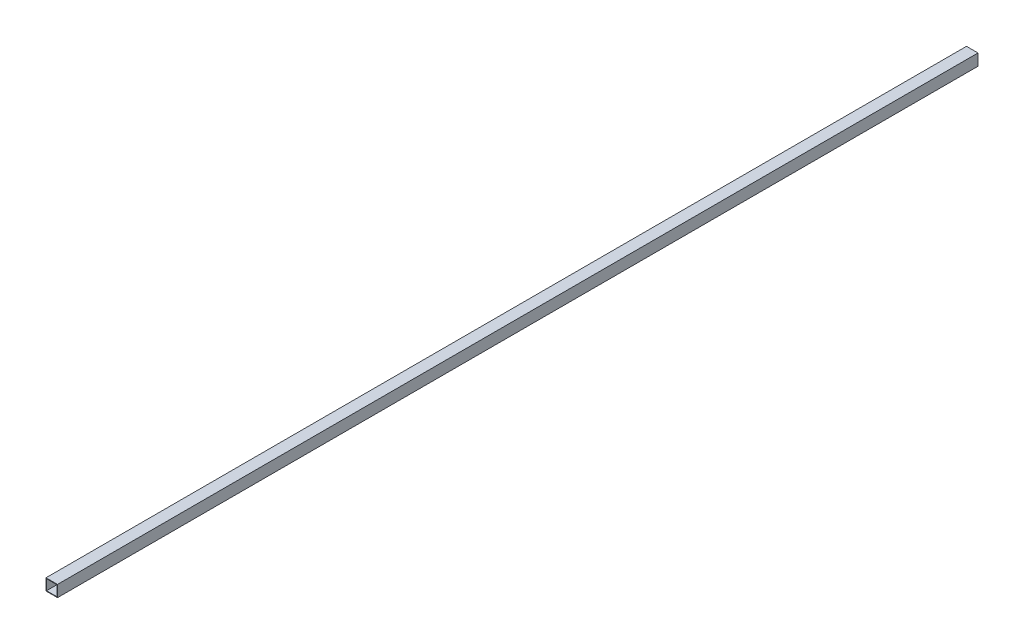
ISO-10303-21;
HEADER;
FILE_DESCRIPTION(('STEP AP214'),'2;1');
FILE_NAME('part.step','',(''),(''),'','','');
FILE_SCHEMA(('AUTOMOTIVE_DESIGN { 1 0 10303 214 1 1 1 1 }'));
ENDSEC;
DATA;
#1=APPLICATION_CONTEXT('core data for automotive mechanical design processes');
#2=APPLICATION_PROTOCOL_DEFINITION('international standard','automotive_design',2000,#1);
#3=PRODUCT_CONTEXT('',#1,'mechanical');
#4=PRODUCT('Part','Part','',(#3));
#5=PRODUCT_RELATED_PRODUCT_CATEGORY('part','',(#4));
#6=PRODUCT_DEFINITION_FORMATION('','',#4);
#7=PRODUCT_DEFINITION_CONTEXT('part definition',#1,'design');
#8=PRODUCT_DEFINITION('design','',#6,#7);
#9=PRODUCT_DEFINITION_SHAPE('','',#8);
#10=(LENGTH_UNIT() NAMED_UNIT(*) SI_UNIT(.MILLI.,.METRE.));
#11=(NAMED_UNIT(*) PLANE_ANGLE_UNIT() SI_UNIT($,.RADIAN.));
#12=(NAMED_UNIT(*) SI_UNIT($,.STERADIAN.) SOLID_ANGLE_UNIT());
#13=UNCERTAINTY_MEASURE_WITH_UNIT(LENGTH_MEASURE(1.E-05),#10,'distance_accuracy_value','');
#14=(GEOMETRIC_REPRESENTATION_CONTEXT(3) GLOBAL_UNCERTAINTY_ASSIGNED_CONTEXT((#13)) GLOBAL_UNIT_ASSIGNED_CONTEXT((#10,
#11,#12)) REPRESENTATION_CONTEXT('',''));
#15=CARTESIAN_POINT('',(0.,0.,0.));
#16=DIRECTION('',(0.,0.,1.));
#17=DIRECTION('',(1.,0.,0.));
#18=AXIS2_PLACEMENT_3D('',#15,#16,#17);
#19=CARTESIAN_POINT('',(0.,0.,1600.));
#20=DIRECTION('',(0.,0.,-1.));
#21=DIRECTION('',(-1.,0.,0.));
#22=AXIS2_PLACEMENT_3D('',#19,#20,#21);
#23=PLANE('',#22);
#24=DIRECTION('',(0.,-1.,0.));
#25=VECTOR('',#24,1.);
#26=CARTESIAN_POINT('',(0.,0.,1600.));
#27=LINE('',#26,#25);
#28=CARTESIAN_POINT('',(0.,20.,1600.));
#29=VERTEX_POINT('',#28);
#30=CARTESIAN_POINT('',(0.,0.,1600.));
#31=VERTEX_POINT('',#30);
#32=EDGE_CURVE('E136',#29,#31,#27,.T.);
#33=ORIENTED_EDGE('',*,*,#32,.T.);
#34=DIRECTION('',(1.,0.,0.));
#35=VECTOR('',#34,1.);
#36=CARTESIAN_POINT('',(0.,0.,1600.));
#37=LINE('',#36,#35);
#38=CARTESIAN_POINT('',(20.,0.,1600.));
#39=VERTEX_POINT('',#38);
#40=EDGE_CURVE('E139',#31,#39,#37,.T.);
#41=ORIENTED_EDGE('',*,*,#40,.T.);
#42=DIRECTION('',(0.,1.,0.));
#43=VECTOR('',#42,1.);
#44=CARTESIAN_POINT('',(20.,0.,1600.));
#45=LINE('',#44,#43);
#46=CARTESIAN_POINT('',(20.,20.,1600.));
#47=VERTEX_POINT('',#46);
#48=EDGE_CURVE('E142',#39,#47,#45,.T.);
#49=ORIENTED_EDGE('',*,*,#48,.T.);
#50=DIRECTION('',(-1.,0.,0.));
#51=VECTOR('',#50,1.);
#52=CARTESIAN_POINT('',(0.,20.,1600.));
#53=LINE('',#52,#51);
#54=EDGE_CURVE('E144',#47,#29,#53,.T.);
#55=ORIENTED_EDGE('',*,*,#54,.T.);
#56=EDGE_LOOP('',(#33,#41,#49,#55));
#57=FACE_BOUND('',#56,.T.);
#58=DIRECTION('',(0.,-1.,0.));
#59=VECTOR('',#58,1.);
#60=CARTESIAN_POINT('',(1.,1.,1600.));
#61=LINE('',#60,#59);
#62=CARTESIAN_POINT('',(1.,19.,1600.));
#63=VERTEX_POINT('',#62);
#64=CARTESIAN_POINT('',(1.,1.,1600.));
#65=VERTEX_POINT('',#64);
#66=EDGE_CURVE('E100',#63,#65,#61,.T.);
#67=ORIENTED_EDGE('',*,*,#66,.F.);
#68=DIRECTION('',(-1.,0.,0.));
#69=VECTOR('',#68,1.);
#70=CARTESIAN_POINT('',(1.,19.,1600.));
#71=LINE('',#70,#69);
#72=CARTESIAN_POINT('',(19.,19.,1600.));
#73=VERTEX_POINT('',#72);
#74=EDGE_CURVE('E122',#73,#63,#71,.T.);
#75=ORIENTED_EDGE('',*,*,#74,.F.);
#76=DIRECTION('',(0.,1.,0.));
#77=VECTOR('',#76,1.);
#78=CARTESIAN_POINT('',(19.,1.,1600.));
#79=LINE('',#78,#77);
#80=CARTESIAN_POINT('',(19.,1.,1600.));
#81=VERTEX_POINT('',#80);
#82=EDGE_CURVE('E120',#81,#73,#79,.T.);
#83=ORIENTED_EDGE('',*,*,#82,.F.);
#84=DIRECTION('',(1.,0.,0.));
#85=VECTOR('',#84,1.);
#86=CARTESIAN_POINT('',(1.,1.,1600.));
#87=LINE('',#86,#85);
#88=EDGE_CURVE('E108',#65,#81,#87,.T.);
#89=ORIENTED_EDGE('',*,*,#88,.F.);
#90=EDGE_LOOP('',(#67,#75,#83,#89));
#91=FACE_BOUND('',#90,.T.);
#92=ADVANCED_FACE('F35',(#57,#91),#23,.F.);
#93=CARTESIAN_POINT('',(0.,0.,0.));
#94=DIRECTION('',(0.,0.,-1.));
#95=DIRECTION('',(-1.,0.,0.));
#96=AXIS2_PLACEMENT_3D('',#93,#94,#95);
#97=PLANE('',#96);
#98=DIRECTION('',(0.,-1.,0.));
#99=VECTOR('',#98,1.);
#100=CARTESIAN_POINT('',(0.,0.,0.));
#101=LINE('',#100,#99);
#102=CARTESIAN_POINT('',(0.,20.,0.));
#103=VERTEX_POINT('',#102);
#104=CARTESIAN_POINT('',(0.,0.,0.));
#105=VERTEX_POINT('',#104);
#106=EDGE_CURVE('E116',#103,#105,#101,.T.);
#107=ORIENTED_EDGE('',*,*,#106,.F.);
#108=DIRECTION('',(-1.,0.,0.));
#109=VECTOR('',#108,1.);
#110=CARTESIAN_POINT('',(0.,20.,0.));
#111=LINE('',#110,#109);
#112=CARTESIAN_POINT('',(20.,20.,0.));
#113=VERTEX_POINT('',#112);
#114=EDGE_CURVE('E140',#113,#103,#111,.T.);
#115=ORIENTED_EDGE('',*,*,#114,.F.);
#116=DIRECTION('',(0.,1.,0.));
#117=VECTOR('',#116,1.);
#118=CARTESIAN_POINT('',(20.,0.,0.));
#119=LINE('',#118,#117);
#120=CARTESIAN_POINT('',(20.,0.,0.));
#121=VERTEX_POINT('',#120);
#122=EDGE_CURVE('E151',#121,#113,#119,.T.);
#123=ORIENTED_EDGE('',*,*,#122,.F.);
#124=DIRECTION('',(1.,0.,0.));
#125=VECTOR('',#124,1.);
#126=CARTESIAN_POINT('',(0.,0.,0.));
#127=LINE('',#126,#125);
#128=EDGE_CURVE('E149',#105,#121,#127,.T.);
#129=ORIENTED_EDGE('',*,*,#128,.F.);
#130=EDGE_LOOP('',(#107,#115,#123,#129));
#131=FACE_BOUND('',#130,.T.);
#132=DIRECTION('',(-1.,0.,0.));
#133=VECTOR('',#132,1.);
#134=CARTESIAN_POINT('',(1.,19.,0.));
#135=LINE('',#134,#133);
#136=CARTESIAN_POINT('',(19.,19.,0.));
#137=VERTEX_POINT('',#136);
#138=CARTESIAN_POINT('',(1.,19.,0.));
#139=VERTEX_POINT('',#138);
#140=EDGE_CURVE('E109',#137,#139,#135,.T.);
#141=ORIENTED_EDGE('',*,*,#140,.T.);
#142=DIRECTION('',(0.,-1.,0.));
#143=VECTOR('',#142,1.);
#144=CARTESIAN_POINT('',(1.,1.,0.));
#145=LINE('',#144,#143);
#146=CARTESIAN_POINT('',(1.,1.,0.));
#147=VERTEX_POINT('',#146);
#148=EDGE_CURVE('E58',#139,#147,#145,.T.);
#149=ORIENTED_EDGE('',*,*,#148,.T.);
#150=DIRECTION('',(1.,0.,0.));
#151=VECTOR('',#150,1.);
#152=CARTESIAN_POINT('',(1.,1.,0.));
#153=LINE('',#152,#151);
#154=CARTESIAN_POINT('',(19.,1.,0.));
#155=VERTEX_POINT('',#154);
#156=EDGE_CURVE('E115',#147,#155,#153,.T.);
#157=ORIENTED_EDGE('',*,*,#156,.T.);
#158=DIRECTION('',(0.,1.,0.));
#159=VECTOR('',#158,1.);
#160=CARTESIAN_POINT('',(19.,1.,0.));
#161=LINE('',#160,#159);
#162=EDGE_CURVE('E128',#155,#137,#161,.T.);
#163=ORIENTED_EDGE('',*,*,#162,.T.);
#164=EDGE_LOOP('',(#141,#149,#157,#163));
#165=FACE_BOUND('',#164,.T.);
#166=ADVANCED_FACE('F169',(#131,#165),#97,.T.);
#167=CARTESIAN_POINT('',(0.,0.,1600.));
#168=DIRECTION('',(1.,0.,0.));
#169=DIRECTION('',(0.,0.,-1.));
#170=AXIS2_PLACEMENT_3D('',#167,#168,#169);
#171=PLANE('',#170);
#172=ORIENTED_EDGE('',*,*,#106,.T.);
#173=DIRECTION('',(0.,0.,-1.));
#174=VECTOR('',#173,1.);
#175=CARTESIAN_POINT('',(0.,0.,1600.));
#176=LINE('',#175,#174);
#177=EDGE_CURVE('E11',#31,#105,#176,.T.);
#178=ORIENTED_EDGE('',*,*,#177,.F.);
#179=ORIENTED_EDGE('',*,*,#32,.F.);
#180=DIRECTION('',(0.,0.,-1.));
#181=VECTOR('',#180,1.);
#182=CARTESIAN_POINT('',(0.,20.,1600.));
#183=LINE('',#182,#181);
#184=EDGE_CURVE('E146',#29,#103,#183,.T.);
#185=ORIENTED_EDGE('',*,*,#184,.T.);
#186=EDGE_LOOP('',(#172,#178,#179,#185));
#187=FACE_BOUND('',#186,.T.);
#188=ADVANCED_FACE('F37',(#187),#171,.F.);
#189=CARTESIAN_POINT('',(0.,0.,1600.));
#190=DIRECTION('',(0.,1.,0.));
#191=DIRECTION('',(0.,0.,1.));
#192=AXIS2_PLACEMENT_3D('',#189,#190,#191);
#193=PLANE('',#192);
#194=ORIENTED_EDGE('',*,*,#128,.T.);
#195=DIRECTION('',(0.,0.,-1.));
#196=VECTOR('',#195,1.);
#197=CARTESIAN_POINT('',(20.,0.,1600.));
#198=LINE('',#197,#196);
#199=EDGE_CURVE('E43',#39,#121,#198,.T.);
#200=ORIENTED_EDGE('',*,*,#199,.F.);
#201=ORIENTED_EDGE('',*,*,#40,.F.);
#202=ORIENTED_EDGE('',*,*,#177,.T.);
#203=EDGE_LOOP('',(#194,#200,#201,#202));
#204=FACE_BOUND('',#203,.T.);
#205=ADVANCED_FACE('F179',(#204),#193,.F.);
#206=CARTESIAN_POINT('',(20.,0.,1600.));
#207=DIRECTION('',(-1.,0.,0.));
#208=DIRECTION('',(0.,0.,1.));
#209=AXIS2_PLACEMENT_3D('',#206,#207,#208);
#210=PLANE('',#209);
#211=ORIENTED_EDGE('',*,*,#122,.T.);
#212=DIRECTION('',(0.,0.,-1.));
#213=VECTOR('',#212,1.);
#214=CARTESIAN_POINT('',(20.,20.,1600.));
#215=LINE('',#214,#213);
#216=EDGE_CURVE('E156',#47,#113,#215,.T.);
#217=ORIENTED_EDGE('',*,*,#216,.F.);
#218=ORIENTED_EDGE('',*,*,#48,.F.);
#219=ORIENTED_EDGE('',*,*,#199,.T.);
#220=EDGE_LOOP('',(#211,#217,#218,#219));
#221=FACE_BOUND('',#220,.T.);
#222=ADVANCED_FACE('F163',(#221),#210,.F.);
#223=CARTESIAN_POINT('',(0.,20.,1600.));
#224=DIRECTION('',(0.,-1.,0.));
#225=DIRECTION('',(0.,0.,-1.));
#226=AXIS2_PLACEMENT_3D('',#223,#224,#225);
#227=PLANE('',#226);
#228=ORIENTED_EDGE('',*,*,#114,.T.);
#229=ORIENTED_EDGE('',*,*,#184,.F.);
#230=ORIENTED_EDGE('',*,*,#54,.F.);
#231=ORIENTED_EDGE('',*,*,#216,.T.);
#232=EDGE_LOOP('',(#228,#229,#230,#231));
#233=FACE_BOUND('',#232,.T.);
#234=ADVANCED_FACE('F173',(#233),#227,.F.);
#235=CARTESIAN_POINT('',(1.,1.,1600.));
#236=DIRECTION('',(1.,0.,0.));
#237=DIRECTION('',(0.,0.,-1.));
#238=AXIS2_PLACEMENT_3D('',#235,#236,#237);
#239=PLANE('',#238);
#240=ORIENTED_EDGE('',*,*,#148,.F.);
#241=DIRECTION('',(0.,0.,-1.));
#242=VECTOR('',#241,1.);
#243=CARTESIAN_POINT('',(1.,19.,1600.));
#244=LINE('',#243,#242);
#245=EDGE_CURVE('E104',#63,#139,#244,.T.);
#246=ORIENTED_EDGE('',*,*,#245,.F.);
#247=ORIENTED_EDGE('',*,*,#66,.T.);
#248=DIRECTION('',(0.,0.,-1.));
#249=VECTOR('',#248,1.);
#250=CARTESIAN_POINT('',(1.,1.,1600.));
#251=LINE('',#250,#249);
#252=EDGE_CURVE('E103',#65,#147,#251,.T.);
#253=ORIENTED_EDGE('',*,*,#252,.T.);
#254=EDGE_LOOP('',(#240,#246,#247,#253));
#255=FACE_BOUND('',#254,.T.);
#256=ADVANCED_FACE('F102',(#255),#239,.T.);
#257=CARTESIAN_POINT('',(1.,1.,1600.));
#258=DIRECTION('',(0.,1.,0.));
#259=DIRECTION('',(0.,0.,1.));
#260=AXIS2_PLACEMENT_3D('',#257,#258,#259);
#261=PLANE('',#260);
#262=ORIENTED_EDGE('',*,*,#156,.F.);
#263=ORIENTED_EDGE('',*,*,#252,.F.);
#264=ORIENTED_EDGE('',*,*,#88,.T.);
#265=DIRECTION('',(0.,0.,-1.));
#266=VECTOR('',#265,1.);
#267=CARTESIAN_POINT('',(19.,1.,1600.));
#268=LINE('',#267,#266);
#269=EDGE_CURVE('E117',#81,#155,#268,.T.);
#270=ORIENTED_EDGE('',*,*,#269,.T.);
#271=EDGE_LOOP('',(#262,#263,#264,#270));
#272=FACE_BOUND('',#271,.T.);
#273=ADVANCED_FACE('F112',(#272),#261,.T.);
#274=CARTESIAN_POINT('',(19.,1.,1600.));
#275=DIRECTION('',(-1.,0.,0.));
#276=DIRECTION('',(0.,0.,1.));
#277=AXIS2_PLACEMENT_3D('',#274,#275,#276);
#278=PLANE('',#277);
#279=ORIENTED_EDGE('',*,*,#162,.F.);
#280=ORIENTED_EDGE('',*,*,#269,.F.);
#281=ORIENTED_EDGE('',*,*,#82,.T.);
#282=DIRECTION('',(0.,0.,-1.));
#283=VECTOR('',#282,1.);
#284=CARTESIAN_POINT('',(19.,19.,1600.));
#285=LINE('',#284,#283);
#286=EDGE_CURVE('E50',#73,#137,#285,.T.);
#287=ORIENTED_EDGE('',*,*,#286,.T.);
#288=EDGE_LOOP('',(#279,#280,#281,#287));
#289=FACE_BOUND('',#288,.T.);
#290=ADVANCED_FACE('F202',(#289),#278,.T.);
#291=CARTESIAN_POINT('',(1.,19.,1600.));
#292=DIRECTION('',(0.,-1.,0.));
#293=DIRECTION('',(0.,0.,-1.));
#294=AXIS2_PLACEMENT_3D('',#291,#292,#293);
#295=PLANE('',#294);
#296=ORIENTED_EDGE('',*,*,#140,.F.);
#297=ORIENTED_EDGE('',*,*,#286,.F.);
#298=ORIENTED_EDGE('',*,*,#74,.T.);
#299=ORIENTED_EDGE('',*,*,#245,.T.);
#300=EDGE_LOOP('',(#296,#297,#298,#299));
#301=FACE_BOUND('',#300,.T.);
#302=ADVANCED_FACE('F206',(#301),#295,.T.);
#303=CLOSED_SHELL('',(#92,#166,#188,#205,#222,#234,#256,#273,#290,#302));
#304=MANIFOLD_SOLID_BREP('B2',#303);
#305=ADVANCED_BREP_SHAPE_REPRESENTATION('',(#18,#304),#14);
#306=SHAPE_DEFINITION_REPRESENTATION(#9,#305);
ENDSEC;
END-ISO-10303-21;
